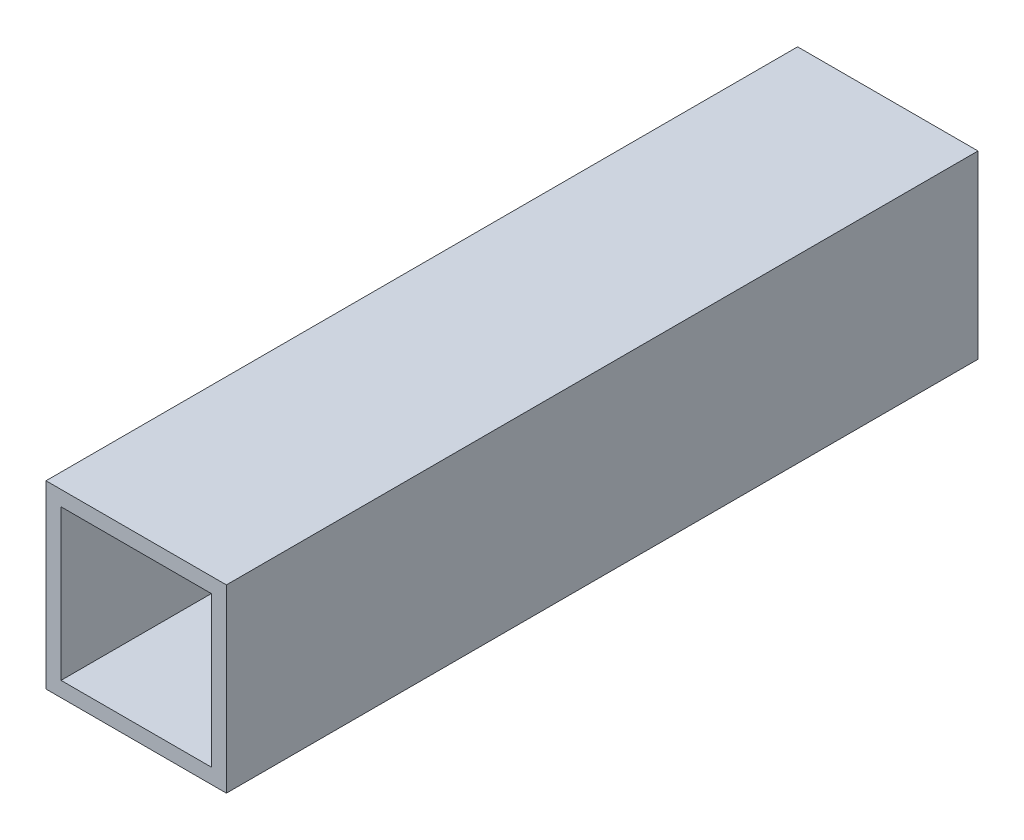
ISO-10303-21;
HEADER;
FILE_DESCRIPTION(('STEP AP214'),'2;1');
FILE_NAME('part.step','',(''),(''),'','','');
FILE_SCHEMA(('AUTOMOTIVE_DESIGN { 1 0 10303 214 1 1 1 1 }'));
ENDSEC;
DATA;
#1=APPLICATION_CONTEXT('core data for automotive mechanical design processes');
#2=APPLICATION_PROTOCOL_DEFINITION('international standard','automotive_design',2000,#1);
#3=PRODUCT_CONTEXT('',#1,'mechanical');
#4=PRODUCT('Part','Part','',(#3));
#5=PRODUCT_RELATED_PRODUCT_CATEGORY('part','',(#4));
#6=PRODUCT_DEFINITION_FORMATION('','',#4);
#7=PRODUCT_DEFINITION_CONTEXT('part definition',#1,'design');
#8=PRODUCT_DEFINITION('design','',#6,#7);
#9=PRODUCT_DEFINITION_SHAPE('','',#8);
#10=(LENGTH_UNIT() NAMED_UNIT(*) SI_UNIT(.MILLI.,.METRE.));
#11=(NAMED_UNIT(*) PLANE_ANGLE_UNIT() SI_UNIT($,.RADIAN.));
#12=(NAMED_UNIT(*) SI_UNIT($,.STERADIAN.) SOLID_ANGLE_UNIT());
#13=UNCERTAINTY_MEASURE_WITH_UNIT(LENGTH_MEASURE(1.E-05),#10,'distance_accuracy_value','');
#14=(GEOMETRIC_REPRESENTATION_CONTEXT(3) GLOBAL_UNCERTAINTY_ASSIGNED_CONTEXT((#13)) GLOBAL_UNIT_ASSIGNED_CONTEXT((#10,
#11,#12)) REPRESENTATION_CONTEXT('',''));
#15=CARTESIAN_POINT('',(0.,0.,0.));
#16=DIRECTION('',(0.,0.,1.));
#17=DIRECTION('',(1.,0.,0.));
#18=AXIS2_PLACEMENT_3D('',#15,#16,#17);
#19=CARTESIAN_POINT('',(0.,0.,100.));
#20=DIRECTION('',(0.,0.,1.));
#21=DIRECTION('',(1.,0.,0.));
#22=AXIS2_PLACEMENT_3D('',#19,#20,#21);
#23=PLANE('',#22);
#24=DIRECTION('',(0.,-1.,0.));
#25=VECTOR('',#24,1.);
#26=CARTESIAN_POINT('',(-12.,12.,100.));
#27=LINE('',#26,#25);
#28=CARTESIAN_POINT('',(-12.,12.,100.));
#29=VERTEX_POINT('',#28);
#30=CARTESIAN_POINT('',(-12.,-12.,100.));
#31=VERTEX_POINT('',#30);
#32=EDGE_CURVE('E136',#29,#31,#27,.T.);
#33=ORIENTED_EDGE('',*,*,#32,.T.);
#34=DIRECTION('',(1.,0.,0.));
#35=VECTOR('',#34,1.);
#36=CARTESIAN_POINT('',(-12.,-12.,100.));
#37=LINE('',#36,#35);
#38=CARTESIAN_POINT('',(12.,-12.,100.));
#39=VERTEX_POINT('',#38);
#40=EDGE_CURVE('E139',#31,#39,#37,.T.);
#41=ORIENTED_EDGE('',*,*,#40,.T.);
#42=DIRECTION('',(0.,1.,0.));
#43=VECTOR('',#42,1.);
#44=CARTESIAN_POINT('',(12.,12.,100.));
#45=LINE('',#44,#43);
#46=CARTESIAN_POINT('',(12.,12.,100.));
#47=VERTEX_POINT('',#46);
#48=EDGE_CURVE('E142',#39,#47,#45,.T.);
#49=ORIENTED_EDGE('',*,*,#48,.T.);
#50=DIRECTION('',(-1.,0.,0.));
#51=VECTOR('',#50,1.);
#52=CARTESIAN_POINT('',(-12.,12.,100.));
#53=LINE('',#52,#51);
#54=EDGE_CURVE('E144',#47,#29,#53,.T.);
#55=ORIENTED_EDGE('',*,*,#54,.T.);
#56=EDGE_LOOP('',(#33,#41,#49,#55));
#57=FACE_BOUND('',#56,.T.);
#58=DIRECTION('',(-1.,0.,0.));
#59=VECTOR('',#58,1.);
#60=CARTESIAN_POINT('',(-10.,10.,100.));
#61=LINE('',#60,#59);
#62=CARTESIAN_POINT('',(10.,10.,100.));
#63=VERTEX_POINT('',#62);
#64=CARTESIAN_POINT('',(-10.,10.,100.));
#65=VERTEX_POINT('',#64);
#66=EDGE_CURVE('E108',#63,#65,#61,.T.);
#67=ORIENTED_EDGE('',*,*,#66,.F.);
#68=DIRECTION('',(0.,1.,0.));
#69=VECTOR('',#68,1.);
#70=CARTESIAN_POINT('',(10.,10.,100.));
#71=LINE('',#70,#69);
#72=CARTESIAN_POINT('',(10.,-10.,100.));
#73=VERTEX_POINT('',#72);
#74=EDGE_CURVE('E100',#73,#63,#71,.T.);
#75=ORIENTED_EDGE('',*,*,#74,.F.);
#76=DIRECTION('',(1.,0.,0.));
#77=VECTOR('',#76,1.);
#78=CARTESIAN_POINT('',(-10.,-10.,100.));
#79=LINE('',#78,#77);
#80=CARTESIAN_POINT('',(-10.,-10.,100.));
#81=VERTEX_POINT('',#80);
#82=EDGE_CURVE('E122',#81,#73,#79,.T.);
#83=ORIENTED_EDGE('',*,*,#82,.F.);
#84=DIRECTION('',(0.,-1.,0.));
#85=VECTOR('',#84,1.);
#86=CARTESIAN_POINT('',(-10.,10.,100.));
#87=LINE('',#86,#85);
#88=EDGE_CURVE('E120',#65,#81,#87,.T.);
#89=ORIENTED_EDGE('',*,*,#88,.F.);
#90=EDGE_LOOP('',(#67,#75,#83,#89));
#91=FACE_BOUND('',#90,.T.);
#92=ADVANCED_FACE('F35',(#57,#91),#23,.T.);
#93=CARTESIAN_POINT('',(0.,0.,0.));
#94=DIRECTION('',(0.,0.,1.));
#95=DIRECTION('',(1.,0.,0.));
#96=AXIS2_PLACEMENT_3D('',#93,#94,#95);
#97=PLANE('',#96);
#98=DIRECTION('',(0.,-1.,0.));
#99=VECTOR('',#98,1.);
#100=CARTESIAN_POINT('',(-12.,12.,0.));
#101=LINE('',#100,#99);
#102=CARTESIAN_POINT('',(-12.,12.,0.));
#103=VERTEX_POINT('',#102);
#104=CARTESIAN_POINT('',(-12.,-12.,0.));
#105=VERTEX_POINT('',#104);
#106=EDGE_CURVE('E116',#103,#105,#101,.T.);
#107=ORIENTED_EDGE('',*,*,#106,.F.);
#108=DIRECTION('',(-1.,0.,0.));
#109=VECTOR('',#108,1.);
#110=CARTESIAN_POINT('',(-12.,12.,0.));
#111=LINE('',#110,#109);
#112=CARTESIAN_POINT('',(12.,12.,0.));
#113=VERTEX_POINT('',#112);
#114=EDGE_CURVE('E140',#113,#103,#111,.T.);
#115=ORIENTED_EDGE('',*,*,#114,.F.);
#116=DIRECTION('',(0.,1.,0.));
#117=VECTOR('',#116,1.);
#118=CARTESIAN_POINT('',(12.,12.,0.));
#119=LINE('',#118,#117);
#120=CARTESIAN_POINT('',(12.,-12.,0.));
#121=VERTEX_POINT('',#120);
#122=EDGE_CURVE('E151',#121,#113,#119,.T.);
#123=ORIENTED_EDGE('',*,*,#122,.F.);
#124=DIRECTION('',(1.,0.,0.));
#125=VECTOR('',#124,1.);
#126=CARTESIAN_POINT('',(-12.,-12.,0.));
#127=LINE('',#126,#125);
#128=EDGE_CURVE('E149',#105,#121,#127,.T.);
#129=ORIENTED_EDGE('',*,*,#128,.F.);
#130=EDGE_LOOP('',(#107,#115,#123,#129));
#131=FACE_BOUND('',#130,.T.);
#132=DIRECTION('',(0.,1.,0.));
#133=VECTOR('',#132,1.);
#134=CARTESIAN_POINT('',(10.,10.,0.));
#135=LINE('',#134,#133);
#136=CARTESIAN_POINT('',(10.,-10.,0.));
#137=VERTEX_POINT('',#136);
#138=CARTESIAN_POINT('',(10.,10.,0.));
#139=VERTEX_POINT('',#138);
#140=EDGE_CURVE('E58',#137,#139,#135,.T.);
#141=ORIENTED_EDGE('',*,*,#140,.T.);
#142=DIRECTION('',(-1.,0.,0.));
#143=VECTOR('',#142,1.);
#144=CARTESIAN_POINT('',(-10.,10.,0.));
#145=LINE('',#144,#143);
#146=CARTESIAN_POINT('',(-10.,10.,0.));
#147=VERTEX_POINT('',#146);
#148=EDGE_CURVE('E115',#139,#147,#145,.T.);
#149=ORIENTED_EDGE('',*,*,#148,.T.);
#150=DIRECTION('',(0.,-1.,0.));
#151=VECTOR('',#150,1.);
#152=CARTESIAN_POINT('',(-10.,10.,0.));
#153=LINE('',#152,#151);
#154=CARTESIAN_POINT('',(-10.,-10.,0.));
#155=VERTEX_POINT('',#154);
#156=EDGE_CURVE('E128',#147,#155,#153,.T.);
#157=ORIENTED_EDGE('',*,*,#156,.T.);
#158=DIRECTION('',(1.,0.,0.));
#159=VECTOR('',#158,1.);
#160=CARTESIAN_POINT('',(-10.,-10.,0.));
#161=LINE('',#160,#159);
#162=EDGE_CURVE('E109',#155,#137,#161,.T.);
#163=ORIENTED_EDGE('',*,*,#162,.T.);
#164=EDGE_LOOP('',(#141,#149,#157,#163));
#165=FACE_BOUND('',#164,.T.);
#166=ADVANCED_FACE('F169',(#131,#165),#97,.F.);
#167=CARTESIAN_POINT('',(-12.,12.,100.));
#168=DIRECTION('',(1.,0.,0.));
#169=DIRECTION('',(0.,1.,0.));
#170=AXIS2_PLACEMENT_3D('',#167,#168,#169);
#171=PLANE('',#170);
#172=ORIENTED_EDGE('',*,*,#106,.T.);
#173=DIRECTION('',(0.,0.,-1.));
#174=VECTOR('',#173,1.);
#175=CARTESIAN_POINT('',(-12.,-12.,100.));
#176=LINE('',#175,#174);
#177=EDGE_CURVE('E11',#31,#105,#176,.T.);
#178=ORIENTED_EDGE('',*,*,#177,.F.);
#179=ORIENTED_EDGE('',*,*,#32,.F.);
#180=DIRECTION('',(0.,0.,-1.));
#181=VECTOR('',#180,1.);
#182=CARTESIAN_POINT('',(-12.,12.,100.));
#183=LINE('',#182,#181);
#184=EDGE_CURVE('E146',#29,#103,#183,.T.);
#185=ORIENTED_EDGE('',*,*,#184,.T.);
#186=EDGE_LOOP('',(#172,#178,#179,#185));
#187=FACE_BOUND('',#186,.T.);
#188=ADVANCED_FACE('F37',(#187),#171,.F.);
#189=CARTESIAN_POINT('',(-12.,-12.,100.));
#190=DIRECTION('',(0.,1.,0.));
#191=DIRECTION('',(-1.,0.,0.));
#192=AXIS2_PLACEMENT_3D('',#189,#190,#191);
#193=PLANE('',#192);
#194=ORIENTED_EDGE('',*,*,#128,.T.);
#195=DIRECTION('',(0.,0.,-1.));
#196=VECTOR('',#195,1.);
#197=CARTESIAN_POINT('',(12.,-12.,100.));
#198=LINE('',#197,#196);
#199=EDGE_CURVE('E43',#39,#121,#198,.T.);
#200=ORIENTED_EDGE('',*,*,#199,.F.);
#201=ORIENTED_EDGE('',*,*,#40,.F.);
#202=ORIENTED_EDGE('',*,*,#177,.T.);
#203=EDGE_LOOP('',(#194,#200,#201,#202));
#204=FACE_BOUND('',#203,.T.);
#205=ADVANCED_FACE('F179',(#204),#193,.F.);
#206=CARTESIAN_POINT('',(12.,12.,100.));
#207=DIRECTION('',(-1.,0.,0.));
#208=DIRECTION('',(0.,-1.,0.));
#209=AXIS2_PLACEMENT_3D('',#206,#207,#208);
#210=PLANE('',#209);
#211=ORIENTED_EDGE('',*,*,#122,.T.);
#212=DIRECTION('',(0.,0.,-1.));
#213=VECTOR('',#212,1.);
#214=CARTESIAN_POINT('',(12.,12.,100.));
#215=LINE('',#214,#213);
#216=EDGE_CURVE('E156',#47,#113,#215,.T.);
#217=ORIENTED_EDGE('',*,*,#216,.F.);
#218=ORIENTED_EDGE('',*,*,#48,.F.);
#219=ORIENTED_EDGE('',*,*,#199,.T.);
#220=EDGE_LOOP('',(#211,#217,#218,#219));
#221=FACE_BOUND('',#220,.T.);
#222=ADVANCED_FACE('F163',(#221),#210,.F.);
#223=CARTESIAN_POINT('',(-12.,12.,100.));
#224=DIRECTION('',(0.,-1.,0.));
#225=DIRECTION('',(0.,0.,-1.));
#226=AXIS2_PLACEMENT_3D('',#223,#224,#225);
#227=PLANE('',#226);
#228=ORIENTED_EDGE('',*,*,#114,.T.);
#229=ORIENTED_EDGE('',*,*,#184,.F.);
#230=ORIENTED_EDGE('',*,*,#54,.F.);
#231=ORIENTED_EDGE('',*,*,#216,.T.);
#232=EDGE_LOOP('',(#228,#229,#230,#231));
#233=FACE_BOUND('',#232,.T.);
#234=ADVANCED_FACE('F173',(#233),#227,.F.);
#235=CARTESIAN_POINT('',(10.,10.,100.));
#236=DIRECTION('',(-1.,0.,0.));
#237=DIRECTION('',(0.,0.,1.));
#238=AXIS2_PLACEMENT_3D('',#235,#236,#237);
#239=PLANE('',#238);
#240=ORIENTED_EDGE('',*,*,#140,.F.);
#241=DIRECTION('',(0.,0.,-1.));
#242=VECTOR('',#241,1.);
#243=CARTESIAN_POINT('',(10.,-10.,100.));
#244=LINE('',#243,#242);
#245=EDGE_CURVE('E104',#73,#137,#244,.T.);
#246=ORIENTED_EDGE('',*,*,#245,.F.);
#247=ORIENTED_EDGE('',*,*,#74,.T.);
#248=DIRECTION('',(0.,0.,-1.));
#249=VECTOR('',#248,1.);
#250=CARTESIAN_POINT('',(10.,10.,100.));
#251=LINE('',#250,#249);
#252=EDGE_CURVE('E103',#63,#139,#251,.T.);
#253=ORIENTED_EDGE('',*,*,#252,.T.);
#254=EDGE_LOOP('',(#240,#246,#247,#253));
#255=FACE_BOUND('',#254,.T.);
#256=ADVANCED_FACE('F102',(#255),#239,.T.);
#257=CARTESIAN_POINT('',(-10.,10.,100.));
#258=DIRECTION('',(0.,-1.,0.));
#259=DIRECTION('',(0.,0.,-1.));
#260=AXIS2_PLACEMENT_3D('',#257,#258,#259);
#261=PLANE('',#260);
#262=ORIENTED_EDGE('',*,*,#148,.F.);
#263=ORIENTED_EDGE('',*,*,#252,.F.);
#264=ORIENTED_EDGE('',*,*,#66,.T.);
#265=DIRECTION('',(0.,0.,-1.));
#266=VECTOR('',#265,1.);
#267=CARTESIAN_POINT('',(-10.,10.,100.));
#268=LINE('',#267,#266);
#269=EDGE_CURVE('E117',#65,#147,#268,.T.);
#270=ORIENTED_EDGE('',*,*,#269,.T.);
#271=EDGE_LOOP('',(#262,#263,#264,#270));
#272=FACE_BOUND('',#271,.T.);
#273=ADVANCED_FACE('F112',(#272),#261,.T.);
#274=CARTESIAN_POINT('',(-10.,10.,100.));
#275=DIRECTION('',(1.,0.,0.));
#276=DIRECTION('',(0.,1.,0.));
#277=AXIS2_PLACEMENT_3D('',#274,#275,#276);
#278=PLANE('',#277);
#279=ORIENTED_EDGE('',*,*,#156,.F.);
#280=ORIENTED_EDGE('',*,*,#269,.F.);
#281=ORIENTED_EDGE('',*,*,#88,.T.);
#282=DIRECTION('',(0.,0.,-1.));
#283=VECTOR('',#282,1.);
#284=CARTESIAN_POINT('',(-10.,-10.,100.));
#285=LINE('',#284,#283);
#286=EDGE_CURVE('E50',#81,#155,#285,.T.);
#287=ORIENTED_EDGE('',*,*,#286,.T.);
#288=EDGE_LOOP('',(#279,#280,#281,#287));
#289=FACE_BOUND('',#288,.T.);
#290=ADVANCED_FACE('F202',(#289),#278,.T.);
#291=CARTESIAN_POINT('',(-10.,-10.,100.));
#292=DIRECTION('',(0.,1.,0.));
#293=DIRECTION('',(0.,0.,1.));
#294=AXIS2_PLACEMENT_3D('',#291,#292,#293);
#295=PLANE('',#294);
#296=ORIENTED_EDGE('',*,*,#162,.F.);
#297=ORIENTED_EDGE('',*,*,#286,.F.);
#298=ORIENTED_EDGE('',*,*,#82,.T.);
#299=ORIENTED_EDGE('',*,*,#245,.T.);
#300=EDGE_LOOP('',(#296,#297,#298,#299));
#301=FACE_BOUND('',#300,.T.);
#302=ADVANCED_FACE('F206',(#301),#295,.T.);
#303=CLOSED_SHELL('',(#92,#166,#188,#205,#222,#234,#256,#273,#290,#302));
#304=MANIFOLD_SOLID_BREP('B2',#303);
#305=ADVANCED_BREP_SHAPE_REPRESENTATION('',(#18,#304),#14);
#306=SHAPE_DEFINITION_REPRESENTATION(#9,#305);
ENDSEC;
END-ISO-10303-21;
